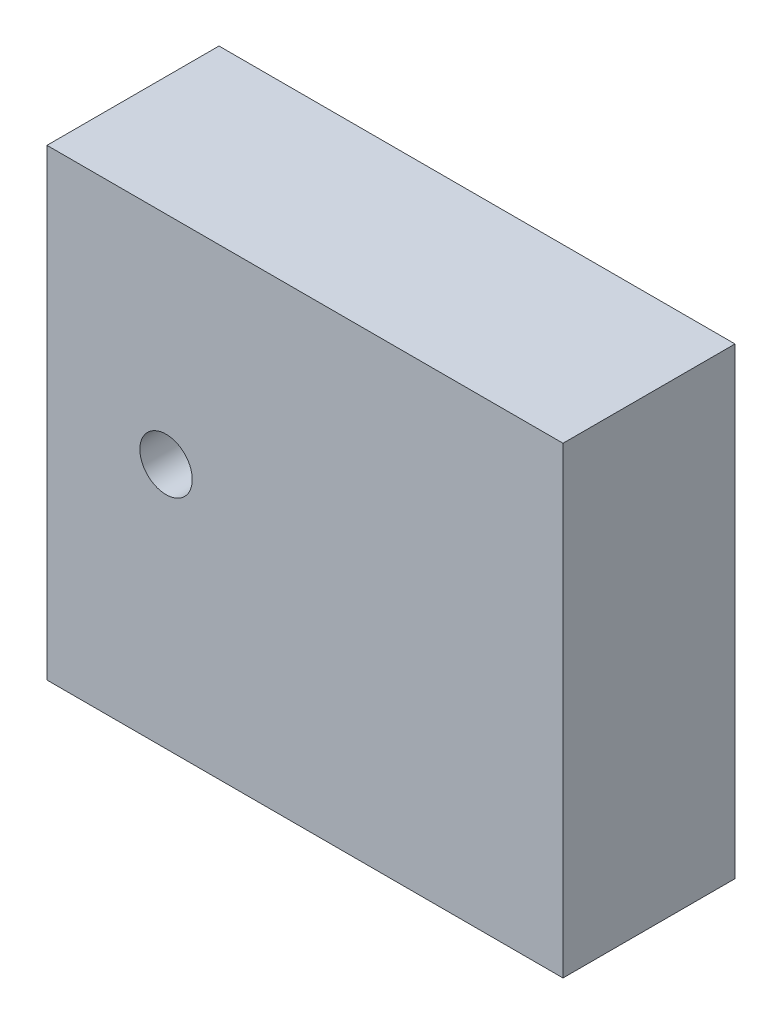
ISO-10303-21;
HEADER;
FILE_DESCRIPTION(('STEP AP214'),'2;1');
FILE_NAME('part.step','',(''),(''),'','','');
FILE_SCHEMA(('AUTOMOTIVE_DESIGN { 1 0 10303 214 1 1 1 1 }'));
ENDSEC;
DATA;
#1=APPLICATION_CONTEXT('core data for automotive mechanical design processes');
#2=APPLICATION_PROTOCOL_DEFINITION('international standard','automotive_design',2000,#1);
#3=PRODUCT_CONTEXT('',#1,'mechanical');
#4=PRODUCT('Part','Part','',(#3));
#5=PRODUCT_RELATED_PRODUCT_CATEGORY('part','',(#4));
#6=PRODUCT_DEFINITION_FORMATION('','',#4);
#7=PRODUCT_DEFINITION_CONTEXT('part definition',#1,'design');
#8=PRODUCT_DEFINITION('design','',#6,#7);
#9=PRODUCT_DEFINITION_SHAPE('','',#8);
#10=(LENGTH_UNIT() NAMED_UNIT(*) SI_UNIT(.MILLI.,.METRE.));
#11=(NAMED_UNIT(*) PLANE_ANGLE_UNIT() SI_UNIT($,.RADIAN.));
#12=(NAMED_UNIT(*) SI_UNIT($,.STERADIAN.) SOLID_ANGLE_UNIT());
#13=UNCERTAINTY_MEASURE_WITH_UNIT(LENGTH_MEASURE(1.E-05),#10,'distance_accuracy_value','');
#14=(GEOMETRIC_REPRESENTATION_CONTEXT(3) GLOBAL_UNCERTAINTY_ASSIGNED_CONTEXT((#13)) GLOBAL_UNIT_ASSIGNED_CONTEXT((#10,
#11,#12)) REPRESENTATION_CONTEXT('',''));
#15=CARTESIAN_POINT('',(0.,0.,0.));
#16=DIRECTION('',(0.,0.,1.));
#17=DIRECTION('',(1.,0.,0.));
#18=AXIS2_PLACEMENT_3D('',#15,#16,#17);
#19=CARTESIAN_POINT('',(0.,0.,13.));
#20=DIRECTION('',(0.,0.,-1.));
#21=DIRECTION('',(-1.,0.,0.));
#22=AXIS2_PLACEMENT_3D('',#19,#20,#21);
#23=PLANE('',#22);
#24=DIRECTION('',(0.,1.,0.));
#25=VECTOR('',#24,1.);
#26=CARTESIAN_POINT('',(19.5,-17.5,13.));
#27=LINE('',#26,#25);
#28=CARTESIAN_POINT('',(19.5,-17.5,13.));
#29=VERTEX_POINT('',#28);
#30=CARTESIAN_POINT('',(19.5,17.5,13.));
#31=VERTEX_POINT('',#30);
#32=EDGE_CURVE('E85',#29,#31,#27,.T.);
#33=ORIENTED_EDGE('',*,*,#32,.T.);
#34=DIRECTION('',(-1.,0.,0.));
#35=VECTOR('',#34,1.);
#36=CARTESIAN_POINT('',(-19.5,17.5,13.));
#37=LINE('',#36,#35);
#38=CARTESIAN_POINT('',(-19.5,17.5,13.));
#39=VERTEX_POINT('',#38);
#40=EDGE_CURVE('E80',#31,#39,#37,.T.);
#41=ORIENTED_EDGE('',*,*,#40,.T.);
#42=DIRECTION('',(0.,-1.,0.));
#43=VECTOR('',#42,1.);
#44=CARTESIAN_POINT('',(-19.5,-17.5,13.));
#45=LINE('',#44,#43);
#46=CARTESIAN_POINT('',(-19.5,-17.5,13.));
#47=VERTEX_POINT('',#46);
#48=EDGE_CURVE('E83',#39,#47,#45,.T.);
#49=ORIENTED_EDGE('',*,*,#48,.T.);
#50=DIRECTION('',(1.,0.,0.));
#51=VECTOR('',#50,1.);
#52=CARTESIAN_POINT('',(-19.5,-17.5,13.));
#53=LINE('',#52,#51);
#54=EDGE_CURVE('E50',#47,#29,#53,.T.);
#55=ORIENTED_EDGE('',*,*,#54,.T.);
#56=EDGE_LOOP('',(#33,#41,#49,#55));
#57=FACE_BOUND('',#56,.T.);
#58=CARTESIAN_POINT('',(-10.5,1.11447368421052,13.));
#59=DIRECTION('',(0.,0.,1.));
#60=DIRECTION('',(1.,0.,0.));
#61=AXIS2_PLACEMENT_3D('',#58,#59,#60);
#62=CIRCLE('',#61,1.97989898732233);
#63=CARTESIAN_POINT('',(-12.4798989873223,1.11447368421052,13.));
#64=VERTEX_POINT('',#63);
#65=EDGE_CURVE('E100',#64,#64,#62,.T.);
#66=ORIENTED_EDGE('',*,*,#65,.F.);
#67=EDGE_LOOP('',(#66));
#68=FACE_BOUND('',#67,.T.);
#69=ADVANCED_FACE('F33',(#57,#68),#23,.F.);
#70=CARTESIAN_POINT('',(0.,0.,0.));
#71=DIRECTION('',(0.,0.,-1.));
#72=DIRECTION('',(-1.,0.,0.));
#73=AXIS2_PLACEMENT_3D('',#70,#71,#72);
#74=PLANE('',#73);
#75=DIRECTION('',(0.,1.,0.));
#76=VECTOR('',#75,1.);
#77=CARTESIAN_POINT('',(19.5,-17.5,0.));
#78=LINE('',#77,#76);
#79=CARTESIAN_POINT('',(19.5,-17.5,0.));
#80=VERTEX_POINT('',#79);
#81=CARTESIAN_POINT('',(19.5,17.5,0.));
#82=VERTEX_POINT('',#81);
#83=EDGE_CURVE('E97',#80,#82,#78,.T.);
#84=ORIENTED_EDGE('',*,*,#83,.F.);
#85=DIRECTION('',(1.,0.,0.));
#86=VECTOR('',#85,1.);
#87=CARTESIAN_POINT('',(-19.5,-17.5,0.));
#88=LINE('',#87,#86);
#89=CARTESIAN_POINT('',(-19.5,-17.5,0.));
#90=VERTEX_POINT('',#89);
#91=EDGE_CURVE('E73',#90,#80,#88,.T.);
#92=ORIENTED_EDGE('',*,*,#91,.F.);
#93=DIRECTION('',(0.,-1.,0.));
#94=VECTOR('',#93,1.);
#95=CARTESIAN_POINT('',(-19.5,-17.5,0.));
#96=LINE('',#95,#94);
#97=CARTESIAN_POINT('',(-19.5,17.5,0.));
#98=VERTEX_POINT('',#97);
#99=EDGE_CURVE('E67',#98,#90,#96,.T.);
#100=ORIENTED_EDGE('',*,*,#99,.F.);
#101=DIRECTION('',(-1.,0.,0.));
#102=VECTOR('',#101,1.);
#103=CARTESIAN_POINT('',(-19.5,17.5,0.));
#104=LINE('',#103,#102);
#105=EDGE_CURVE('E89',#82,#98,#104,.T.);
#106=ORIENTED_EDGE('',*,*,#105,.F.);
#107=EDGE_LOOP('',(#84,#92,#100,#106));
#108=FACE_BOUND('',#107,.T.);
#109=CARTESIAN_POINT('',(-10.5,1.11447368421052,0.));
#110=DIRECTION('',(0.,0.,1.));
#111=DIRECTION('',(1.,0.,0.));
#112=AXIS2_PLACEMENT_3D('',#109,#110,#111);
#113=CIRCLE('',#112,1.97989898732233);
#114=CARTESIAN_POINT('',(-12.4798989873223,1.11447368421052,0.));
#115=VERTEX_POINT('',#114);
#116=EDGE_CURVE('E112',#115,#115,#113,.T.);
#117=ORIENTED_EDGE('',*,*,#116,.T.);
#118=EDGE_LOOP('',(#117));
#119=FACE_BOUND('',#118,.T.);
#120=ADVANCED_FACE('F108',(#108,#119),#74,.T.);
#121=CARTESIAN_POINT('',(19.5,-17.5,13.));
#122=DIRECTION('',(-1.,0.,0.));
#123=DIRECTION('',(0.,0.,1.));
#124=AXIS2_PLACEMENT_3D('',#121,#122,#123);
#125=PLANE('',#124);
#126=ORIENTED_EDGE('',*,*,#83,.T.);
#127=DIRECTION('',(0.,0.,-1.));
#128=VECTOR('',#127,1.);
#129=CARTESIAN_POINT('',(19.5,17.5,13.));
#130=LINE('',#129,#128);
#131=EDGE_CURVE('E11',#31,#82,#130,.T.);
#132=ORIENTED_EDGE('',*,*,#131,.F.);
#133=ORIENTED_EDGE('',*,*,#32,.F.);
#134=DIRECTION('',(0.,0.,-1.));
#135=VECTOR('',#134,1.);
#136=CARTESIAN_POINT('',(19.5,-17.5,13.));
#137=LINE('',#136,#135);
#138=EDGE_CURVE('E93',#29,#80,#137,.T.);
#139=ORIENTED_EDGE('',*,*,#138,.T.);
#140=EDGE_LOOP('',(#126,#132,#133,#139));
#141=FACE_BOUND('',#140,.T.);
#142=ADVANCED_FACE('F35',(#141),#125,.F.);
#143=CARTESIAN_POINT('',(-19.5,17.5,13.));
#144=DIRECTION('',(0.,-1.,0.));
#145=DIRECTION('',(0.,0.,-1.));
#146=AXIS2_PLACEMENT_3D('',#143,#144,#145);
#147=PLANE('',#146);
#148=ORIENTED_EDGE('',*,*,#105,.T.);
#149=DIRECTION('',(0.,0.,-1.));
#150=VECTOR('',#149,1.);
#151=CARTESIAN_POINT('',(-19.5,17.5,13.));
#152=LINE('',#151,#150);
#153=EDGE_CURVE('E42',#39,#98,#152,.T.);
#154=ORIENTED_EDGE('',*,*,#153,.F.);
#155=ORIENTED_EDGE('',*,*,#40,.F.);
#156=ORIENTED_EDGE('',*,*,#131,.T.);
#157=EDGE_LOOP('',(#148,#154,#155,#156));
#158=FACE_BOUND('',#157,.T.);
#159=ADVANCED_FACE('F88',(#158),#147,.F.);
#160=CARTESIAN_POINT('',(-19.5,-17.5,13.));
#161=DIRECTION('',(1.,0.,0.));
#162=DIRECTION('',(0.,0.,-1.));
#163=AXIS2_PLACEMENT_3D('',#160,#161,#162);
#164=PLANE('',#163);
#165=ORIENTED_EDGE('',*,*,#99,.T.);
#166=DIRECTION('',(0.,0.,-1.));
#167=VECTOR('',#166,1.);
#168=CARTESIAN_POINT('',(-19.5,-17.5,13.));
#169=LINE('',#168,#167);
#170=EDGE_CURVE('E90',#47,#90,#169,.T.);
#171=ORIENTED_EDGE('',*,*,#170,.F.);
#172=ORIENTED_EDGE('',*,*,#48,.F.);
#173=ORIENTED_EDGE('',*,*,#153,.T.);
#174=EDGE_LOOP('',(#165,#171,#172,#173));
#175=FACE_BOUND('',#174,.T.);
#176=ADVANCED_FACE('F91',(#175),#164,.F.);
#177=CARTESIAN_POINT('',(-19.5,-17.5,13.));
#178=DIRECTION('',(0.,1.,0.));
#179=DIRECTION('',(0.,0.,1.));
#180=AXIS2_PLACEMENT_3D('',#177,#178,#179);
#181=PLANE('',#180);
#182=ORIENTED_EDGE('',*,*,#91,.T.);
#183=ORIENTED_EDGE('',*,*,#138,.F.);
#184=ORIENTED_EDGE('',*,*,#54,.F.);
#185=ORIENTED_EDGE('',*,*,#170,.T.);
#186=EDGE_LOOP('',(#182,#183,#184,#185));
#187=FACE_BOUND('',#186,.T.);
#188=ADVANCED_FACE('F105',(#187),#181,.F.);
#189=CARTESIAN_POINT('',(-10.5,1.11447368421052,13.));
#190=DIRECTION('',(0.,0.,-1.));
#191=DIRECTION('',(-1.,0.,0.));
#192=AXIS2_PLACEMENT_3D('',#189,#190,#191);
#193=CYLINDRICAL_SURFACE('',#192,1.97989898732233);
#194=CARTESIAN_POINT('',(-12.4798989873223,1.11447368421052,13.));
#195=CARTESIAN_POINT('',(-12.4798989873223,1.11447368421052,12.8645833333333));
#196=CARTESIAN_POINT('',(-12.4798989873223,1.11447368421052,12.7291666666667));
#197=CARTESIAN_POINT('',(-12.4798989873223,1.11447368421052,12.4583333333333));
#198=CARTESIAN_POINT('',(-12.4798989873223,1.11447368421052,12.3229166666667));
#199=CARTESIAN_POINT('',(-12.4798989873223,1.11447368421052,12.0520833333333));
#200=CARTESIAN_POINT('',(-12.4798989873223,1.11447368421052,11.9166666666667));
#201=CARTESIAN_POINT('',(-12.4798989873223,1.11447368421052,11.6458333333333));
#202=CARTESIAN_POINT('',(-12.4798989873223,1.11447368421052,11.5104166666667));
#203=CARTESIAN_POINT('',(-12.4798989873223,1.11447368421052,11.2395833333333));
#204=CARTESIAN_POINT('',(-12.4798989873223,1.11447368421052,11.1041666666667));
#205=CARTESIAN_POINT('',(-12.4798989873223,1.11447368421052,10.8333333333333));
#206=CARTESIAN_POINT('',(-12.4798989873223,1.11447368421052,10.6979166666667));
#207=CARTESIAN_POINT('',(-12.4798989873223,1.11447368421052,10.4270833333333));
#208=CARTESIAN_POINT('',(-12.4798989873223,1.11447368421052,10.2916666666667));
#209=CARTESIAN_POINT('',(-12.4798989873223,1.11447368421052,10.0208333333333));
#210=CARTESIAN_POINT('',(-12.4798989873223,1.11447368421052,9.88541666666667));
#211=CARTESIAN_POINT('',(-12.4798989873223,1.11447368421052,9.61458333333333));
#212=CARTESIAN_POINT('',(-12.4798989873223,1.11447368421052,9.47916666666667));
#213=CARTESIAN_POINT('',(-12.4798989873223,1.11447368421052,9.20833333333333));
#214=CARTESIAN_POINT('',(-12.4798989873223,1.11447368421052,9.07291666666666));
#215=CARTESIAN_POINT('',(-12.4798989873223,1.11447368421052,8.80208333333333));
#216=CARTESIAN_POINT('',(-12.4798989873223,1.11447368421052,8.66666666666667));
#217=CARTESIAN_POINT('',(-12.4798989873223,1.11447368421052,8.39583333333333));
#218=CARTESIAN_POINT('',(-12.4798989873223,1.11447368421052,8.26041666666667));
#219=CARTESIAN_POINT('',(-12.4798989873223,1.11447368421052,7.98958333333333));
#220=CARTESIAN_POINT('',(-12.4798989873223,1.11447368421052,7.85416666666667));
#221=CARTESIAN_POINT('',(-12.4798989873223,1.11447368421052,7.58333333333333));
#222=CARTESIAN_POINT('',(-12.4798989873223,1.11447368421052,7.44791666666667));
#223=CARTESIAN_POINT('',(-12.4798989873223,1.11447368421052,7.17708333333333));
#224=CARTESIAN_POINT('',(-12.4798989873223,1.11447368421052,7.04166666666667));
#225=CARTESIAN_POINT('',(-12.4798989873223,1.11447368421052,6.77083333333333));
#226=CARTESIAN_POINT('',(-12.4798989873223,1.11447368421052,6.63541666666667));
#227=CARTESIAN_POINT('',(-12.4798989873223,1.11447368421052,6.36458333333333));
#228=CARTESIAN_POINT('',(-12.4798989873223,1.11447368421052,6.22916666666667));
#229=CARTESIAN_POINT('',(-12.4798989873223,1.11447368421052,5.95833333333333));
#230=CARTESIAN_POINT('',(-12.4798989873223,1.11447368421052,5.82291666666667));
#231=CARTESIAN_POINT('',(-12.4798989873223,1.11447368421052,5.55208333333333));
#232=CARTESIAN_POINT('',(-12.4798989873223,1.11447368421052,5.41666666666667));
#233=CARTESIAN_POINT('',(-12.4798989873223,1.11447368421052,5.14583333333333));
#234=CARTESIAN_POINT('',(-12.4798989873223,1.11447368421052,5.01041666666667));
#235=CARTESIAN_POINT('',(-12.4798989873223,1.11447368421052,4.73958333333333));
#236=CARTESIAN_POINT('',(-12.4798989873223,1.11447368421052,4.60416666666667));
#237=CARTESIAN_POINT('',(-12.4798989873223,1.11447368421052,4.33333333333333));
#238=CARTESIAN_POINT('',(-12.4798989873223,1.11447368421052,4.19791666666667));
#239=CARTESIAN_POINT('',(-12.4798989873223,1.11447368421052,3.92708333333333));
#240=CARTESIAN_POINT('',(-12.4798989873223,1.11447368421052,3.79166666666667));
#241=CARTESIAN_POINT('',(-12.4798989873223,1.11447368421052,3.52083333333333));
#242=CARTESIAN_POINT('',(-12.4798989873223,1.11447368421052,3.38541666666667));
#243=CARTESIAN_POINT('',(-12.4798989873223,1.11447368421052,3.11458333333333));
#244=CARTESIAN_POINT('',(-12.4798989873223,1.11447368421052,2.97916666666667));
#245=CARTESIAN_POINT('',(-12.4798989873223,1.11447368421052,2.70833333333333));
#246=CARTESIAN_POINT('',(-12.4798989873223,1.11447368421052,2.57291666666667));
#247=CARTESIAN_POINT('',(-12.4798989873223,1.11447368421052,2.30208333333333));
#248=CARTESIAN_POINT('',(-12.4798989873223,1.11447368421052,2.16666666666667));
#249=CARTESIAN_POINT('',(-12.4798989873223,1.11447368421052,1.89583333333333));
#250=CARTESIAN_POINT('',(-12.4798989873223,1.11447368421052,1.76041666666667));
#251=CARTESIAN_POINT('',(-12.4798989873223,1.11447368421052,1.48958333333333));
#252=CARTESIAN_POINT('',(-12.4798989873223,1.11447368421052,1.35416666666667));
#253=CARTESIAN_POINT('',(-12.4798989873223,1.11447368421052,1.08333333333333));
#254=CARTESIAN_POINT('',(-12.4798989873223,1.11447368421052,0.947916666666667));
#255=CARTESIAN_POINT('',(-12.4798989873223,1.11447368421052,0.677083333333334));
#256=CARTESIAN_POINT('',(-12.4798989873223,1.11447368421052,0.541666666666667));
#257=CARTESIAN_POINT('',(-12.4798989873223,1.11447368421052,0.270833333333334));
#258=CARTESIAN_POINT('',(-12.4798989873223,1.11447368421052,0.135416666666667));
#259=CARTESIAN_POINT('',(-12.4798989873223,1.11447368421052,0.));
#260=B_SPLINE_CURVE_WITH_KNOTS('',3,(#194,#195,#196,#197,#198,#199,#200,#201,#202,#203,#204,
#205,#206,#207,#208,#209,#210,#211,#212,#213,#214,#215,#216,#217,#218,#219,#220,#221,#222,#223,
#224,#225,#226,#227,#228,#229,#230,#231,#232,#233,#234,#235,#236,#237,#238,#239,#240,#241,#242,
#243,#244,#245,#246,#247,#248,#249,#250,#251,#252,#253,#254,#255,#256,#257,#258,#259),
.UNSPECIFIED.,.F.,.F.,(4,2,2,2,2,2,2,2,2,2,2,2,2,2,2,2,2,2,2,2,2,2,2,2,2,2,2,2,2,2,2,2,4),(0.,
0.40625,0.812500000000001,1.21875,1.625,2.03125,2.4375,2.84375,3.25,3.65625,4.0625,4.46875,
4.875,5.28125,5.6875,6.09375,6.5,6.90625,7.3125,7.71875,8.125,8.53125,8.9375,9.34375,9.75,
10.15625,10.5625,10.96875,11.375,11.78125,12.1875,12.59375,13.),.UNSPECIFIED.);
#261=EDGE_CURVE('BSEAM118',#64,#115,#260,.T.);
#262=ORIENTED_EDGE('',*,*,#65,.T.);
#263=ORIENTED_EDGE('',*,*,#116,.F.);
#264=ORIENTED_EDGE('',*,*,#261,.T.);
#265=ORIENTED_EDGE('',*,*,#261,.F.);
#266=EDGE_LOOP('',(#262,#264,#263,#265));
#267=FACE_BOUND('',#266,.T.);
#268=ADVANCED_FACE('F118',(#267),#193,.F.);
#269=CLOSED_SHELL('',(#69,#120,#142,#159,#176,#188,#268));
#270=MANIFOLD_SOLID_BREP('B2',#269);
#271=ADVANCED_BREP_SHAPE_REPRESENTATION('',(#18,#270),#14);
#272=SHAPE_DEFINITION_REPRESENTATION(#9,#271);
ENDSEC;
END-ISO-10303-21;
